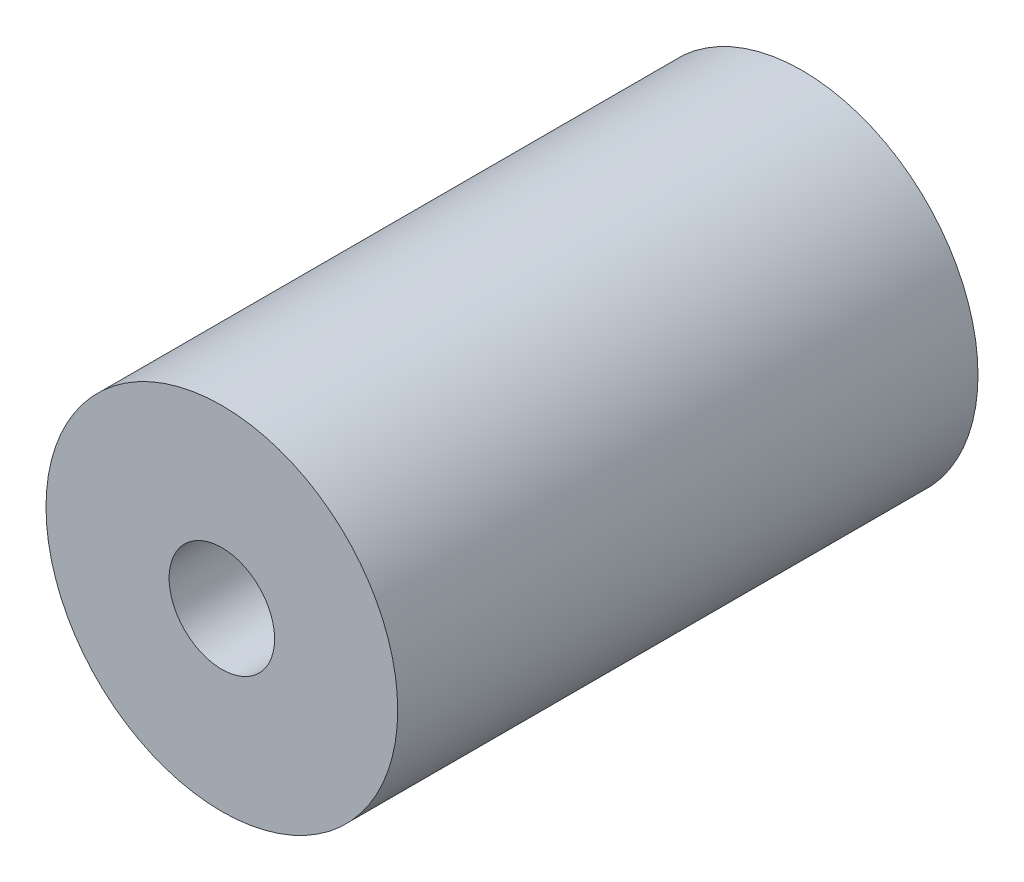
ISO-10303-21;
HEADER;
FILE_DESCRIPTION(('STEP AP214'),'2;1');
FILE_NAME('part.step','',(''),(''),'','','');
FILE_SCHEMA(('AUTOMOTIVE_DESIGN { 1 0 10303 214 1 1 1 1 }'));
ENDSEC;
DATA;
#1=APPLICATION_CONTEXT('core data for automotive mechanical design processes');
#2=APPLICATION_PROTOCOL_DEFINITION('international standard','automotive_design',2000,#1);
#3=PRODUCT_CONTEXT('',#1,'mechanical');
#4=PRODUCT('Part','Part','',(#3));
#5=PRODUCT_RELATED_PRODUCT_CATEGORY('part','',(#4));
#6=PRODUCT_DEFINITION_FORMATION('','',#4);
#7=PRODUCT_DEFINITION_CONTEXT('part definition',#1,'design');
#8=PRODUCT_DEFINITION('design','',#6,#7);
#9=PRODUCT_DEFINITION_SHAPE('','',#8);
#10=(LENGTH_UNIT() NAMED_UNIT(*) SI_UNIT(.MILLI.,.METRE.));
#11=(NAMED_UNIT(*) PLANE_ANGLE_UNIT() SI_UNIT($,.RADIAN.));
#12=(NAMED_UNIT(*) SI_UNIT($,.STERADIAN.) SOLID_ANGLE_UNIT());
#13=UNCERTAINTY_MEASURE_WITH_UNIT(LENGTH_MEASURE(1.E-05),#10,'distance_accuracy_value','');
#14=(GEOMETRIC_REPRESENTATION_CONTEXT(3) GLOBAL_UNCERTAINTY_ASSIGNED_CONTEXT((#13)) GLOBAL_UNIT_ASSIGNED_CONTEXT((#10,
#11,#12)) REPRESENTATION_CONTEXT('',''));
#15=CARTESIAN_POINT('',(0.,0.,0.));
#16=DIRECTION('',(0.,0.,1.));
#17=DIRECTION('',(1.,0.,0.));
#18=AXIS2_PLACEMENT_3D('',#15,#16,#17);
#19=CARTESIAN_POINT('',(0.,0.,33.));
#20=DIRECTION('',(0.,0.,-1.));
#21=DIRECTION('',(-1.,0.,0.));
#22=AXIS2_PLACEMENT_3D('',#19,#20,#21);
#23=CYLINDRICAL_SURFACE('',#22,10.);
#24=CARTESIAN_POINT('',(0.,0.,33.));
#25=DIRECTION('',(0.,0.,1.));
#26=DIRECTION('',(1.,0.,0.));
#27=AXIS2_PLACEMENT_3D('',#24,#25,#26);
#28=CIRCLE('',#27,10.);
#29=CARTESIAN_POINT('',(10.,0.,33.));
#30=VERTEX_POINT('',#29);
#31=EDGE_CURVE('E10',#30,#30,#28,.T.);
#32=ORIENTED_EDGE('',*,*,#31,.F.);
#33=EDGE_LOOP('',(#32));
#34=FACE_BOUND('',#33,.T.);
#35=CARTESIAN_POINT('',(0.,0.,0.));
#36=DIRECTION('',(0.,0.,1.));
#37=DIRECTION('',(1.,0.,0.));
#38=AXIS2_PLACEMENT_3D('',#35,#36,#37);
#39=CIRCLE('',#38,10.);
#40=CARTESIAN_POINT('',(10.,0.,0.));
#41=VERTEX_POINT('',#40);
#42=EDGE_CURVE('E42',#41,#41,#39,.T.);
#43=ORIENTED_EDGE('',*,*,#42,.T.);
#44=EDGE_LOOP('',(#43));
#45=FACE_BOUND('',#44,.T.);
#46=ADVANCED_FACE('F39',(#34,#45),#23,.T.);
#47=CARTESIAN_POINT('',(0.,0.,33.));
#48=DIRECTION('',(0.,0.,1.));
#49=DIRECTION('',(1.,0.,0.));
#50=AXIS2_PLACEMENT_3D('',#47,#48,#49);
#51=PLANE('',#50);
#52=CARTESIAN_POINT('',(0.,0.,33.));
#53=DIRECTION('',(0.,0.,1.));
#54=DIRECTION('',(1.,0.,0.));
#55=AXIS2_PLACEMENT_3D('',#52,#53,#54);
#56=CIRCLE('',#55,3.);
#57=CARTESIAN_POINT('',(3.,0.,33.));
#58=VERTEX_POINT('',#57);
#59=EDGE_CURVE('E57',#58,#58,#56,.T.);
#60=ORIENTED_EDGE('',*,*,#59,.F.);
#61=EDGE_LOOP('',(#60));
#62=FACE_BOUND('',#61,.T.);
#63=ORIENTED_EDGE('',*,*,#31,.T.);
#64=EDGE_LOOP('',(#63));
#65=FACE_BOUND('',#64,.T.);
#66=ADVANCED_FACE('F72',(#62,#65),#51,.T.);
#67=CARTESIAN_POINT('',(0.,0.,0.));
#68=DIRECTION('',(0.,0.,1.));
#69=DIRECTION('',(1.,0.,0.));
#70=AXIS2_PLACEMENT_3D('',#67,#68,#69);
#71=PLANE('',#70);
#72=CARTESIAN_POINT('',(0.,0.,0.));
#73=DIRECTION('',(0.,0.,-1.));
#74=DIRECTION('',(-1.,0.,0.));
#75=AXIS2_PLACEMENT_3D('',#72,#73,#74);
#76=CIRCLE('',#75,5.);
#77=CARTESIAN_POINT('',(-5.,0.,0.));
#78=VERTEX_POINT('',#77);
#79=EDGE_CURVE('E51',#78,#78,#76,.T.);
#80=ORIENTED_EDGE('',*,*,#79,.F.);
#81=EDGE_LOOP('',(#80));
#82=FACE_BOUND('',#81,.T.);
#83=ORIENTED_EDGE('',*,*,#42,.F.);
#84=EDGE_LOOP('',(#83));
#85=FACE_BOUND('',#84,.T.);
#86=ADVANCED_FACE('F74',(#82,#85),#71,.F.);
#87=CARTESIAN_POINT('',(0.,0.,12.));
#88=DIRECTION('',(0.,0.,-1.));
#89=DIRECTION('',(-1.,0.,0.));
#90=AXIS2_PLACEMENT_3D('',#87,#88,#89);
#91=CYLINDRICAL_SURFACE('',#90,5.);
#92=CARTESIAN_POINT('',(0.,0.,12.));
#93=DIRECTION('',(0.,0.,-1.));
#94=DIRECTION('',(-1.,0.,0.));
#95=AXIS2_PLACEMENT_3D('',#92,#93,#94);
#96=CIRCLE('',#95,5.);
#97=CARTESIAN_POINT('',(-5.,0.,12.));
#98=VERTEX_POINT('',#97);
#99=EDGE_CURVE('E49',#98,#98,#96,.T.);
#100=ORIENTED_EDGE('',*,*,#99,.F.);
#101=EDGE_LOOP('',(#100));
#102=FACE_BOUND('',#101,.T.);
#103=ORIENTED_EDGE('',*,*,#79,.T.);
#104=EDGE_LOOP('',(#103));
#105=FACE_BOUND('',#104,.T.);
#106=ADVANCED_FACE('F80',(#102,#105),#91,.F.);
#107=CARTESIAN_POINT('',(0.,0.,12.));
#108=DIRECTION('',(0.,0.,-1.));
#109=DIRECTION('',(-1.,0.,0.));
#110=AXIS2_PLACEMENT_3D('',#107,#108,#109);
#111=PLANE('',#110);
#112=ORIENTED_EDGE('',*,*,#99,.T.);
#113=EDGE_LOOP('',(#112));
#114=FACE_BOUND('',#113,.T.);
#115=ADVANCED_FACE('F68',(#114),#111,.T.);
#116=CARTESIAN_POINT('',(0.,0.,20.));
#117=DIRECTION('',(0.,0.,1.));
#118=DIRECTION('',(1.,0.,0.));
#119=AXIS2_PLACEMENT_3D('',#116,#117,#118);
#120=CYLINDRICAL_SURFACE('',#119,3.);
#121=CARTESIAN_POINT('',(0.,0.,20.));
#122=DIRECTION('',(0.,0.,1.));
#123=DIRECTION('',(1.,0.,0.));
#124=AXIS2_PLACEMENT_3D('',#121,#122,#123);
#125=CIRCLE('',#124,3.);
#126=CARTESIAN_POINT('',(3.,0.,20.));
#127=VERTEX_POINT('',#126);
#128=EDGE_CURVE('E54',#127,#127,#125,.T.);
#129=CARTESIAN_POINT('',(3.,0.,20.));
#130=CARTESIAN_POINT('',(3.,0.,20.1354166666667));
#131=CARTESIAN_POINT('',(3.,0.,20.2708333333333));
#132=CARTESIAN_POINT('',(3.,0.,20.5416666666667));
#133=CARTESIAN_POINT('',(3.,0.,20.6770833333333));
#134=CARTESIAN_POINT('',(3.,0.,20.9479166666667));
#135=CARTESIAN_POINT('',(3.,0.,21.0833333333333));
#136=CARTESIAN_POINT('',(3.,0.,21.3541666666667));
#137=CARTESIAN_POINT('',(3.,0.,21.4895833333333));
#138=CARTESIAN_POINT('',(3.,0.,21.7604166666667));
#139=CARTESIAN_POINT('',(3.,0.,21.8958333333333));
#140=CARTESIAN_POINT('',(3.,0.,22.1666666666667));
#141=CARTESIAN_POINT('',(3.,0.,22.3020833333333));
#142=CARTESIAN_POINT('',(3.,0.,22.5729166666667));
#143=CARTESIAN_POINT('',(3.,0.,22.7083333333333));
#144=CARTESIAN_POINT('',(3.,0.,22.9791666666667));
#145=CARTESIAN_POINT('',(3.,0.,23.1145833333333));
#146=CARTESIAN_POINT('',(3.,0.,23.3854166666667));
#147=CARTESIAN_POINT('',(3.,0.,23.5208333333333));
#148=CARTESIAN_POINT('',(3.,0.,23.7916666666667));
#149=CARTESIAN_POINT('',(3.,0.,23.9270833333333));
#150=CARTESIAN_POINT('',(3.,0.,24.1979166666667));
#151=CARTESIAN_POINT('',(3.,0.,24.3333333333333));
#152=CARTESIAN_POINT('',(3.,0.,24.6041666666667));
#153=CARTESIAN_POINT('',(3.,0.,24.7395833333333));
#154=CARTESIAN_POINT('',(3.,0.,25.0104166666667));
#155=CARTESIAN_POINT('',(3.,0.,25.1458333333333));
#156=CARTESIAN_POINT('',(3.,0.,25.4166666666667));
#157=CARTESIAN_POINT('',(3.,0.,25.5520833333333));
#158=CARTESIAN_POINT('',(3.,0.,25.8229166666667));
#159=CARTESIAN_POINT('',(3.,0.,25.9583333333333));
#160=CARTESIAN_POINT('',(3.,0.,26.2291666666667));
#161=CARTESIAN_POINT('',(3.,0.,26.3645833333333));
#162=CARTESIAN_POINT('',(3.,0.,26.6354166666667));
#163=CARTESIAN_POINT('',(3.,0.,26.7708333333333));
#164=CARTESIAN_POINT('',(3.,0.,27.0416666666667));
#165=CARTESIAN_POINT('',(3.,0.,27.1770833333333));
#166=CARTESIAN_POINT('',(3.,0.,27.4479166666667));
#167=CARTESIAN_POINT('',(3.,0.,27.5833333333333));
#168=CARTESIAN_POINT('',(3.,0.,27.8541666666667));
#169=CARTESIAN_POINT('',(3.,0.,27.9895833333333));
#170=CARTESIAN_POINT('',(3.,0.,28.2604166666667));
#171=CARTESIAN_POINT('',(3.,0.,28.3958333333333));
#172=CARTESIAN_POINT('',(3.,0.,28.6666666666667));
#173=CARTESIAN_POINT('',(3.,0.,28.8020833333333));
#174=CARTESIAN_POINT('',(3.,0.,29.0729166666667));
#175=CARTESIAN_POINT('',(3.,0.,29.2083333333333));
#176=CARTESIAN_POINT('',(3.,0.,29.4791666666667));
#177=CARTESIAN_POINT('',(3.,0.,29.6145833333333));
#178=CARTESIAN_POINT('',(3.,0.,29.8854166666667));
#179=CARTESIAN_POINT('',(3.,0.,30.0208333333333));
#180=CARTESIAN_POINT('',(3.,0.,30.2916666666667));
#181=CARTESIAN_POINT('',(3.,0.,30.4270833333333));
#182=CARTESIAN_POINT('',(3.,0.,30.6979166666667));
#183=CARTESIAN_POINT('',(3.,0.,30.8333333333333));
#184=CARTESIAN_POINT('',(3.,0.,31.1041666666667));
#185=CARTESIAN_POINT('',(3.,0.,31.2395833333333));
#186=CARTESIAN_POINT('',(3.,0.,31.5104166666667));
#187=CARTESIAN_POINT('',(3.,0.,31.6458333333333));
#188=CARTESIAN_POINT('',(3.,0.,31.9166666666667));
#189=CARTESIAN_POINT('',(3.,0.,32.0520833333333));
#190=CARTESIAN_POINT('',(3.,0.,32.3229166666667));
#191=CARTESIAN_POINT('',(3.,0.,32.4583333333333));
#192=CARTESIAN_POINT('',(3.,0.,32.7291666666667));
#193=CARTESIAN_POINT('',(3.,0.,32.8645833333333));
#194=CARTESIAN_POINT('',(3.,0.,33.));
#195=B_SPLINE_CURVE_WITH_KNOTS('',3,(#129,#130,#131,#132,#133,#134,#135,#136,#137,#138,#139,
#140,#141,#142,#143,#144,#145,#146,#147,#148,#149,#150,#151,#152,#153,#154,#155,#156,#157,#158,
#159,#160,#161,#162,#163,#164,#165,#166,#167,#168,#169,#170,#171,#172,#173,#174,#175,#176,#177,
#178,#179,#180,#181,#182,#183,#184,#185,#186,#187,#188,#189,#190,#191,#192,#193,#194),
.UNSPECIFIED.,.F.,.F.,(4,2,2,2,2,2,2,2,2,2,2,2,2,2,2,2,2,2,2,2,2,2,2,2,2,2,2,2,2,2,2,2,4),(0.,
0.406249999999997,0.812499999999997,1.21875,1.625,2.03125,2.4375,2.84375,3.25,3.65625,4.0625,
4.46875,4.875,5.28124999999999,5.68749999999999,6.09374999999999,6.5,6.90625,7.3125,7.71875,
8.12499999999999,8.53124999999999,8.93749999999999,9.34374999999999,9.74999999999999,10.15625,
10.5625,10.96875,11.375,11.78125,12.1875,12.59375,13.),.UNSPECIFIED.);
#196=EDGE_CURVE('BSEAM65',#127,#58,#195,.T.);
#197=ORIENTED_EDGE('',*,*,#128,.F.);
#198=ORIENTED_EDGE('',*,*,#59,.T.);
#199=ORIENTED_EDGE('',*,*,#196,.T.);
#200=ORIENTED_EDGE('',*,*,#196,.F.);
#201=EDGE_LOOP('',(#197,#199,#198,#200));
#202=FACE_BOUND('',#201,.T.);
#203=ADVANCED_FACE('F65',(#202),#120,.F.);
#204=CARTESIAN_POINT('',(0.,0.,20.));
#205=DIRECTION('',(0.,0.,1.));
#206=DIRECTION('',(1.,0.,0.));
#207=AXIS2_PLACEMENT_3D('',#204,#205,#206);
#208=PLANE('',#207);
#209=ORIENTED_EDGE('',*,*,#128,.T.);
#210=EDGE_LOOP('',(#209));
#211=FACE_BOUND('',#210,.T.);
#212=ADVANCED_FACE('F63',(#211),#208,.T.);
#213=CLOSED_SHELL('',(#46,#66,#86,#106,#115,#203,#212));
#214=MANIFOLD_SOLID_BREP('B2',#213);
#215=ADVANCED_BREP_SHAPE_REPRESENTATION('',(#18,#214),#14);
#216=SHAPE_DEFINITION_REPRESENTATION(#9,#215);
ENDSEC;
END-ISO-10303-21;
